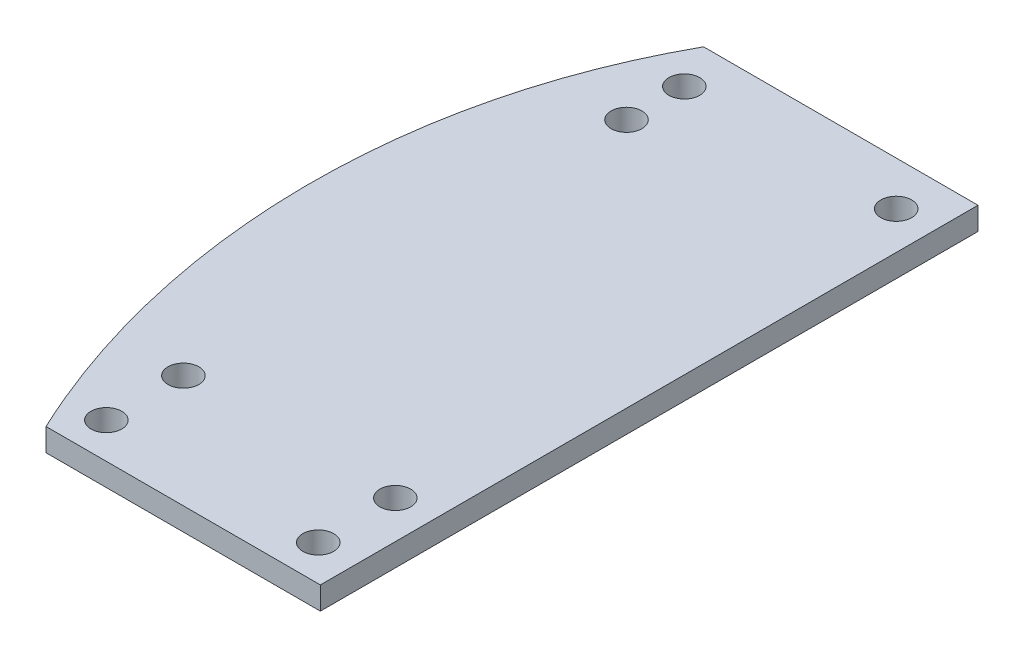
ISO-10303-21;
HEADER;
FILE_DESCRIPTION(('STEP AP214'),'2;1');
FILE_NAME('part.step','',(''),(''),'','','');
FILE_SCHEMA(('AUTOMOTIVE_DESIGN { 1 0 10303 214 1 1 1 1 }'));
ENDSEC;
DATA;
#1=APPLICATION_CONTEXT('core data for automotive mechanical design processes');
#2=APPLICATION_PROTOCOL_DEFINITION('international standard','automotive_design',2000,#1);
#3=PRODUCT_CONTEXT('',#1,'mechanical');
#4=PRODUCT('Part','Part','',(#3));
#5=PRODUCT_RELATED_PRODUCT_CATEGORY('part','',(#4));
#6=PRODUCT_DEFINITION_FORMATION('','',#4);
#7=PRODUCT_DEFINITION_CONTEXT('part definition',#1,'design');
#8=PRODUCT_DEFINITION('design','',#6,#7);
#9=PRODUCT_DEFINITION_SHAPE('','',#8);
#10=(LENGTH_UNIT() NAMED_UNIT(*) SI_UNIT(.MILLI.,.METRE.));
#11=(NAMED_UNIT(*) PLANE_ANGLE_UNIT() SI_UNIT($,.RADIAN.));
#12=(NAMED_UNIT(*) SI_UNIT($,.STERADIAN.) SOLID_ANGLE_UNIT());
#13=UNCERTAINTY_MEASURE_WITH_UNIT(LENGTH_MEASURE(1.E-05),#10,'distance_accuracy_value','');
#14=(GEOMETRIC_REPRESENTATION_CONTEXT(3) GLOBAL_UNCERTAINTY_ASSIGNED_CONTEXT((#13)) GLOBAL_UNIT_ASSIGNED_CONTEXT((#10,
#11,#12)) REPRESENTATION_CONTEXT('',''));
#15=CARTESIAN_POINT('',(0.,0.,0.));
#16=DIRECTION('',(0.,0.,1.));
#17=DIRECTION('',(1.,0.,0.));
#18=AXIS2_PLACEMENT_3D('',#15,#16,#17);
#19=CARTESIAN_POINT('',(20.3965825261335,-1.3622,86.1274069272128));
#20=DIRECTION('',(0.,0.,1.));
#21=DIRECTION('',(1.,0.,0.));
#22=AXIS2_PLACEMENT_3D('',#19,#20,#21);
#23=PLANE('',#22);
#24=DIRECTION('',(0.,1.,0.));
#25=VECTOR('',#24,1.);
#26=CARTESIAN_POINT('',(20.3965825261335,-1.3622,86.1274069272128));
#27=LINE('',#26,#25);
#28=CARTESIAN_POINT('',(20.3965825261335,-1.3622,86.1274069272128));
#29=VERTEX_POINT('',#28);
#30=CARTESIAN_POINT('',(20.3965825261335,1.,86.1274069272128));
#31=VERTEX_POINT('',#30);
#32=EDGE_CURVE('E35',#29,#31,#27,.T.);
#33=ORIENTED_EDGE('',*,*,#32,.T.);
#34=DIRECTION('',(1.,0.,0.));
#35=VECTOR('',#34,1.);
#36=CARTESIAN_POINT('',(20.3965825261335,1.,86.1274069272128));
#37=LINE('',#36,#35);
#38=CARTESIAN_POINT('',(-8.08799373657945,1.,86.1274069272128));
#39=VERTEX_POINT('',#38);
#40=EDGE_CURVE('E72',#39,#31,#37,.T.);
#41=ORIENTED_EDGE('',*,*,#40,.F.);
#42=DIRECTION('',(0.,1.,0.));
#43=VECTOR('',#42,1.);
#44=CARTESIAN_POINT('',(-8.08799373657945,-1.3622,86.1274069272128));
#45=LINE('',#44,#43);
#46=CARTESIAN_POINT('',(-8.08799373657945,-1.3622,86.1274069272128));
#47=VERTEX_POINT('',#46);
#48=EDGE_CURVE('E11',#47,#39,#45,.T.);
#49=ORIENTED_EDGE('',*,*,#48,.F.);
#50=DIRECTION('',(1.,0.,0.));
#51=VECTOR('',#50,1.);
#52=CARTESIAN_POINT('',(20.3965825261335,-1.3622,86.1274069272128));
#53=LINE('',#52,#51);
#54=EDGE_CURVE('E73',#47,#29,#53,.T.);
#55=ORIENTED_EDGE('',*,*,#54,.T.);
#56=EDGE_LOOP('',(#33,#41,#49,#55));
#57=FACE_BOUND('',#56,.T.);
#58=ADVANCED_FACE('F32',(#57),#23,.T.);
#59=CARTESIAN_POINT('',(-8.08799373657945,-1.3622,17.8578544233072));
#60=CARTESIAN_POINT('',(-19.8235237033801,-1.3622,38.9810157448307));
#61=CARTESIAN_POINT('',(-18.0628355171282,-1.3622,64.9856531203526));
#62=CARTESIAN_POINT('',(-8.08799373657945,-1.3622,86.1274069272128));
#63=B_SPLINE_CURVE_WITH_KNOTS('',3,(#59,#60,#61,#62),.UNSPECIFIED.,.F.,.F.,(4,4),(0.,1.),.UNSPECIFIED.);
#64=DIRECTION('',(0.,1.,0.));
#65=VECTOR('',#64,1.);
#66=SURFACE_OF_LINEAR_EXTRUSION('',#63,#65);
#67=ORIENTED_EDGE('',*,*,#48,.T.);
#68=CARTESIAN_POINT('',(-8.08799373657945,1.,17.8578544233072));
#69=CARTESIAN_POINT('',(-19.8235237033801,1.,38.9810157448307));
#70=CARTESIAN_POINT('',(-18.0628355171282,1.,64.9856531203526));
#71=CARTESIAN_POINT('',(-8.08799373657945,1.,86.1274069272128));
#72=B_SPLINE_CURVE_WITH_KNOTS('',3,(#68,#69,#70,#71),.UNSPECIFIED.,.F.,.F.,(4,4),(0.,1.),.UNSPECIFIED.);
#73=CARTESIAN_POINT('',(-8.08799373657945,1.,17.8578544233072));
#74=VERTEX_POINT('',#73);
#75=EDGE_CURVE('E89',#74,#39,#72,.T.);
#76=ORIENTED_EDGE('',*,*,#75,.F.);
#77=DIRECTION('',(0.,1.,0.));
#78=VECTOR('',#77,1.);
#79=CARTESIAN_POINT('',(-8.08799373657945,-1.3622,17.8578544233072));
#80=LINE('',#79,#78);
#81=CARTESIAN_POINT('',(-8.08799373657945,-1.3622,17.8578544233072));
#82=VERTEX_POINT('',#81);
#83=EDGE_CURVE('E40',#82,#74,#80,.T.);
#84=ORIENTED_EDGE('',*,*,#83,.F.);
#85=EDGE_CURVE('E78',#82,#47,#63,.T.);
#86=ORIENTED_EDGE('',*,*,#85,.T.);
#87=EDGE_LOOP('',(#67,#76,#84,#86));
#88=FACE_BOUND('',#87,.T.);
#89=ADVANCED_FACE('F117',(#88),#66,.T.);
#90=CARTESIAN_POINT('',(-8.08799373657945,-1.3622,17.8578544233072));
#91=DIRECTION('',(0.,0.,-1.));
#92=DIRECTION('',(-1.,0.,0.));
#93=AXIS2_PLACEMENT_3D('',#90,#91,#92);
#94=PLANE('',#93);
#95=ORIENTED_EDGE('',*,*,#83,.T.);
#96=DIRECTION('',(-1.,0.,0.));
#97=VECTOR('',#96,1.);
#98=CARTESIAN_POINT('',(-8.08799373657945,1.,17.8578544233072));
#99=LINE('',#98,#97);
#100=CARTESIAN_POINT('',(20.3965825261335,1.,17.8578544233072));
#101=VERTEX_POINT('',#100);
#102=EDGE_CURVE('E85',#101,#74,#99,.T.);
#103=ORIENTED_EDGE('',*,*,#102,.F.);
#104=DIRECTION('',(0.,1.,0.));
#105=VECTOR('',#104,1.);
#106=CARTESIAN_POINT('',(20.3965825261335,-1.3622,17.8578544233072));
#107=LINE('',#106,#105);
#108=CARTESIAN_POINT('',(20.3965825261335,-1.3622,17.8578544233072));
#109=VERTEX_POINT('',#108);
#110=EDGE_CURVE('E77',#109,#101,#107,.T.);
#111=ORIENTED_EDGE('',*,*,#110,.F.);
#112=DIRECTION('',(-1.,0.,0.));
#113=VECTOR('',#112,1.);
#114=CARTESIAN_POINT('',(-8.08799373657945,-1.3622,17.8578544233072));
#115=LINE('',#114,#113);
#116=EDGE_CURVE('E107',#109,#82,#115,.T.);
#117=ORIENTED_EDGE('',*,*,#116,.T.);
#118=EDGE_LOOP('',(#95,#103,#111,#117));
#119=FACE_BOUND('',#118,.T.);
#120=ADVANCED_FACE('F121',(#119),#94,.T.);
#121=CARTESIAN_POINT('',(20.3965825261335,-1.3622,86.1274069272128));
#122=DIRECTION('',(1.,0.,0.));
#123=DIRECTION('',(0.,0.,-1.));
#124=AXIS2_PLACEMENT_3D('',#121,#122,#123);
#125=PLANE('',#124);
#126=ORIENTED_EDGE('',*,*,#110,.T.);
#127=DIRECTION('',(0.,0.,-1.));
#128=VECTOR('',#127,1.);
#129=CARTESIAN_POINT('',(20.3965825261335,1.,86.1274069272128));
#130=LINE('',#129,#128);
#131=EDGE_CURVE('E80',#31,#101,#130,.T.);
#132=ORIENTED_EDGE('',*,*,#131,.F.);
#133=ORIENTED_EDGE('',*,*,#32,.F.);
#134=DIRECTION('',(0.,0.,-1.));
#135=VECTOR('',#134,1.);
#136=CARTESIAN_POINT('',(20.3965825261335,-1.3622,86.1274069272128));
#137=LINE('',#136,#135);
#138=EDGE_CURVE('E105',#29,#109,#137,.T.);
#139=ORIENTED_EDGE('',*,*,#138,.T.);
#140=EDGE_LOOP('',(#126,#132,#133,#139));
#141=FACE_BOUND('',#140,.T.);
#142=ADVANCED_FACE('F81',(#141),#125,.T.);
#143=CARTESIAN_POINT('',(-16.2293831418355,-1.3622,51.9856584932587));
#144=DIRECTION('',(0.,-1.,0.));
#145=DIRECTION('',(0.,0.,-1.));
#146=AXIS2_PLACEMENT_3D('',#143,#144,#145);
#147=PLANE('',#146);
#148=CARTESIAN_POINT('',(-5.52763276646201,-1.3622,28.4235055353303));
#149=DIRECTION('',(0.,-1.,0.));
#150=DIRECTION('',(0.,0.,-1.));
#151=AXIS2_PLACEMENT_3D('',#148,#149,#150);
#152=CIRCLE('',#151,1.6);
#153=CARTESIAN_POINT('',(-5.52763276646201,-1.3622,26.8235055353304));
#154=VERTEX_POINT('',#153);
#155=EDGE_CURVE('E237',#154,#154,#152,.T.);
#156=ORIENTED_EDGE('',*,*,#155,.F.);
#157=EDGE_LOOP('',(#156));
#158=FACE_BOUND('',#157,.T.);
#159=CARTESIAN_POINT('',(16.472367233538,-1.3622,74.4235055353303));
#160=DIRECTION('',(0.,-1.,0.));
#161=DIRECTION('',(0.,0.,-1.));
#162=AXIS2_PLACEMENT_3D('',#159,#160,#161);
#163=CIRCLE('',#162,1.6);
#164=CARTESIAN_POINT('',(16.472367233538,-1.3622,72.8235055353303));
#165=VERTEX_POINT('',#164);
#166=EDGE_CURVE('E247',#165,#165,#163,.T.);
#167=ORIENTED_EDGE('',*,*,#166,.F.);
#168=EDGE_LOOP('',(#167));
#169=FACE_BOUND('',#168,.T.);
#170=CARTESIAN_POINT('',(-5.527632766462,-1.3622,74.4235055353303));
#171=DIRECTION('',(0.,-1.,0.));
#172=DIRECTION('',(0.,0.,-1.));
#173=AXIS2_PLACEMENT_3D('',#170,#171,#172);
#174=CIRCLE('',#173,1.6);
#175=CARTESIAN_POINT('',(-5.527632766462,-1.3622,72.8235055353303));
#176=VERTEX_POINT('',#175);
#177=EDGE_CURVE('E253',#176,#176,#174,.T.);
#178=ORIENTED_EDGE('',*,*,#177,.F.);
#179=EDGE_LOOP('',(#178));
#180=FACE_BOUND('',#179,.T.);
#181=CARTESIAN_POINT('',(16.472367233538,-1.3622,82.4235055353303));
#182=DIRECTION('',(0.,-1.,0.));
#183=DIRECTION('',(0.,0.,-1.));
#184=AXIS2_PLACEMENT_3D('',#181,#182,#183);
#185=CIRCLE('',#184,1.60000000000001);
#186=CARTESIAN_POINT('',(16.472367233538,-1.3622,80.8235055353303));
#187=VERTEX_POINT('',#186);
#188=EDGE_CURVE('E259',#187,#187,#185,.T.);
#189=ORIENTED_EDGE('',*,*,#188,.F.);
#190=EDGE_LOOP('',(#189));
#191=FACE_BOUND('',#190,.T.);
#192=CARTESIAN_POINT('',(-5.527632766462,-1.3622,82.4235055353303));
#193=DIRECTION('',(0.,-1.,0.));
#194=DIRECTION('',(0.,0.,-1.));
#195=AXIS2_PLACEMENT_3D('',#192,#193,#194);
#196=CIRCLE('',#195,1.60000000000001);
#197=CARTESIAN_POINT('',(-5.527632766462,-1.3622,80.8235055353303));
#198=VERTEX_POINT('',#197);
#199=EDGE_CURVE('E265',#198,#198,#196,.T.);
#200=ORIENTED_EDGE('',*,*,#199,.F.);
#201=EDGE_LOOP('',(#200));
#202=FACE_BOUND('',#201,.T.);
#203=CARTESIAN_POINT('',(16.472367233538,-1.3622,22.4235055353303));
#204=DIRECTION('',(0.,-1.,0.));
#205=DIRECTION('',(0.,0.,-1.));
#206=AXIS2_PLACEMENT_3D('',#203,#204,#205);
#207=CIRCLE('',#206,1.6);
#208=CARTESIAN_POINT('',(16.472367233538,-1.3622,20.8235055353304));
#209=VERTEX_POINT('',#208);
#210=EDGE_CURVE('E271',#209,#209,#207,.T.);
#211=ORIENTED_EDGE('',*,*,#210,.F.);
#212=EDGE_LOOP('',(#211));
#213=FACE_BOUND('',#212,.T.);
#214=CARTESIAN_POINT('',(-5.52763276646201,-1.3622,22.4235055353304));
#215=DIRECTION('',(0.,-1.,0.));
#216=DIRECTION('',(0.,0.,-1.));
#217=AXIS2_PLACEMENT_3D('',#214,#215,#216);
#218=CIRCLE('',#217,1.59999999999999);
#219=CARTESIAN_POINT('',(-5.52763276646201,-1.3622,20.8235055353304));
#220=VERTEX_POINT('',#219);
#221=EDGE_CURVE('E90',#220,#220,#218,.T.);
#222=ORIENTED_EDGE('',*,*,#221,.F.);
#223=EDGE_LOOP('',(#222));
#224=FACE_BOUND('',#223,.T.);
#225=ORIENTED_EDGE('',*,*,#54,.F.);
#226=ORIENTED_EDGE('',*,*,#85,.F.);
#227=ORIENTED_EDGE('',*,*,#116,.F.);
#228=ORIENTED_EDGE('',*,*,#138,.F.);
#229=EDGE_LOOP('',(#225,#226,#227,#228));
#230=FACE_BOUND('',#229,.T.);
#231=ADVANCED_FACE('F122',(#158,#169,#180,#191,#202,#213,#224,#230),#147,.T.);
#232=CARTESIAN_POINT('',(-16.2293831418355,1.,51.9856584932587));
#233=DIRECTION('',(0.,-1.,0.));
#234=DIRECTION('',(0.,0.,-1.));
#235=AXIS2_PLACEMENT_3D('',#232,#233,#234);
#236=PLANE('',#235);
#237=CARTESIAN_POINT('',(-5.52763276646201,1.,28.4235055353303));
#238=DIRECTION('',(0.,1.,0.));
#239=DIRECTION('',(0.,0.,1.));
#240=AXIS2_PLACEMENT_3D('',#237,#238,#239);
#241=CIRCLE('',#240,1.6);
#242=CARTESIAN_POINT('',(-5.52763276646201,1.,30.0235055353304));
#243=VERTEX_POINT('',#242);
#244=EDGE_CURVE('E240',#243,#243,#241,.T.);
#245=ORIENTED_EDGE('',*,*,#244,.F.);
#246=EDGE_LOOP('',(#245));
#247=FACE_BOUND('',#246,.T.);
#248=CARTESIAN_POINT('',(16.472367233538,1.,74.4235055353303));
#249=DIRECTION('',(0.,1.,0.));
#250=DIRECTION('',(0.,0.,1.));
#251=AXIS2_PLACEMENT_3D('',#248,#249,#250);
#252=CIRCLE('',#251,1.6);
#253=CARTESIAN_POINT('',(16.472367233538,1.,76.0235055353304));
#254=VERTEX_POINT('',#253);
#255=EDGE_CURVE('E242',#254,#254,#252,.T.);
#256=ORIENTED_EDGE('',*,*,#255,.F.);
#257=EDGE_LOOP('',(#256));
#258=FACE_BOUND('',#257,.T.);
#259=CARTESIAN_POINT('',(-5.527632766462,1.,74.4235055353303));
#260=DIRECTION('',(0.,1.,0.));
#261=DIRECTION('',(0.,0.,1.));
#262=AXIS2_PLACEMENT_3D('',#259,#260,#261);
#263=CIRCLE('',#262,1.6);
#264=CARTESIAN_POINT('',(-5.527632766462,1.,76.0235055353304));
#265=VERTEX_POINT('',#264);
#266=EDGE_CURVE('E250',#265,#265,#263,.T.);
#267=ORIENTED_EDGE('',*,*,#266,.F.);
#268=EDGE_LOOP('',(#267));
#269=FACE_BOUND('',#268,.T.);
#270=CARTESIAN_POINT('',(16.472367233538,1.,82.4235055353303));
#271=DIRECTION('',(0.,1.,0.));
#272=DIRECTION('',(0.,0.,1.));
#273=AXIS2_PLACEMENT_3D('',#270,#271,#272);
#274=CIRCLE('',#273,1.60000000000001);
#275=CARTESIAN_POINT('',(16.472367233538,1.,84.0235055353304));
#276=VERTEX_POINT('',#275);
#277=EDGE_CURVE('E256',#276,#276,#274,.T.);
#278=ORIENTED_EDGE('',*,*,#277,.F.);
#279=EDGE_LOOP('',(#278));
#280=FACE_BOUND('',#279,.T.);
#281=CARTESIAN_POINT('',(-5.527632766462,1.,82.4235055353303));
#282=DIRECTION('',(0.,1.,0.));
#283=DIRECTION('',(0.,0.,1.));
#284=AXIS2_PLACEMENT_3D('',#281,#282,#283);
#285=CIRCLE('',#284,1.60000000000001);
#286=CARTESIAN_POINT('',(-5.527632766462,1.,84.0235055353303));
#287=VERTEX_POINT('',#286);
#288=EDGE_CURVE('E262',#287,#287,#285,.T.);
#289=ORIENTED_EDGE('',*,*,#288,.F.);
#290=EDGE_LOOP('',(#289));
#291=FACE_BOUND('',#290,.T.);
#292=CARTESIAN_POINT('',(16.472367233538,1.,22.4235055353303));
#293=DIRECTION('',(0.,1.,0.));
#294=DIRECTION('',(0.,0.,1.));
#295=AXIS2_PLACEMENT_3D('',#292,#293,#294);
#296=CIRCLE('',#295,1.6);
#297=CARTESIAN_POINT('',(16.472367233538,1.,24.0235055353303));
#298=VERTEX_POINT('',#297);
#299=EDGE_CURVE('E268',#298,#298,#296,.T.);
#300=ORIENTED_EDGE('',*,*,#299,.F.);
#301=EDGE_LOOP('',(#300));
#302=FACE_BOUND('',#301,.T.);
#303=CARTESIAN_POINT('',(-5.52763276646201,1.,22.4235055353304));
#304=DIRECTION('',(0.,1.,0.));
#305=DIRECTION('',(0.,0.,1.));
#306=AXIS2_PLACEMENT_3D('',#303,#304,#305);
#307=CIRCLE('',#306,1.59999999999999);
#308=CARTESIAN_POINT('',(-5.52763276646201,1.,24.0235055353303));
#309=VERTEX_POINT('',#308);
#310=EDGE_CURVE('E93',#309,#309,#307,.T.);
#311=ORIENTED_EDGE('',*,*,#310,.F.);
#312=EDGE_LOOP('',(#311));
#313=FACE_BOUND('',#312,.T.);
#314=ORIENTED_EDGE('',*,*,#40,.T.);
#315=ORIENTED_EDGE('',*,*,#131,.T.);
#316=ORIENTED_EDGE('',*,*,#102,.T.);
#317=ORIENTED_EDGE('',*,*,#75,.T.);
#318=EDGE_LOOP('',(#314,#315,#316,#317));
#319=FACE_BOUND('',#318,.T.);
#320=ADVANCED_FACE('F88',(#247,#258,#269,#280,#291,#302,#313,#319),#236,.F.);
#321=CARTESIAN_POINT('',(-5.52763276646201,-9.,22.4235055353304));
#322=DIRECTION('',(0.,1.,0.));
#323=DIRECTION('',(0.,0.,1.));
#324=AXIS2_PLACEMENT_3D('',#321,#322,#323);
#325=CYLINDRICAL_SURFACE('',#324,1.59999999999999);
#326=ORIENTED_EDGE('',*,*,#221,.T.);
#327=EDGE_LOOP('',(#326));
#328=FACE_BOUND('',#327,.T.);
#329=ORIENTED_EDGE('',*,*,#310,.T.);
#330=EDGE_LOOP('',(#329));
#331=FACE_BOUND('',#330,.T.);
#332=ADVANCED_FACE('F161',(#328,#331),#325,.F.);
#333=CARTESIAN_POINT('',(16.472367233538,-9.,22.4235055353303));
#334=DIRECTION('',(0.,1.,0.));
#335=DIRECTION('',(0.,0.,1.));
#336=AXIS2_PLACEMENT_3D('',#333,#334,#335);
#337=CYLINDRICAL_SURFACE('',#336,1.6);
#338=ORIENTED_EDGE('',*,*,#210,.T.);
#339=EDGE_LOOP('',(#338));
#340=FACE_BOUND('',#339,.T.);
#341=ORIENTED_EDGE('',*,*,#299,.T.);
#342=EDGE_LOOP('',(#341));
#343=FACE_BOUND('',#342,.T.);
#344=ADVANCED_FACE('F170',(#340,#343),#337,.F.);
#345=CARTESIAN_POINT('',(-5.527632766462,-9.,82.4235055353303));
#346=DIRECTION('',(0.,1.,0.));
#347=DIRECTION('',(0.,0.,1.));
#348=AXIS2_PLACEMENT_3D('',#345,#346,#347);
#349=CYLINDRICAL_SURFACE('',#348,1.60000000000001);
#350=ORIENTED_EDGE('',*,*,#199,.T.);
#351=EDGE_LOOP('',(#350));
#352=FACE_BOUND('',#351,.T.);
#353=ORIENTED_EDGE('',*,*,#288,.T.);
#354=EDGE_LOOP('',(#353));
#355=FACE_BOUND('',#354,.T.);
#356=ADVANCED_FACE('F180',(#352,#355),#349,.F.);
#357=CARTESIAN_POINT('',(16.472367233538,-9.,82.4235055353303));
#358=DIRECTION('',(0.,1.,0.));
#359=DIRECTION('',(0.,0.,1.));
#360=AXIS2_PLACEMENT_3D('',#357,#358,#359);
#361=CYLINDRICAL_SURFACE('',#360,1.60000000000001);
#362=ORIENTED_EDGE('',*,*,#188,.T.);
#363=EDGE_LOOP('',(#362));
#364=FACE_BOUND('',#363,.T.);
#365=ORIENTED_EDGE('',*,*,#277,.T.);
#366=EDGE_LOOP('',(#365));
#367=FACE_BOUND('',#366,.T.);
#368=ADVANCED_FACE('F190',(#364,#367),#361,.F.);
#369=CARTESIAN_POINT('',(-5.527632766462,-9.,74.4235055353303));
#370=DIRECTION('',(0.,1.,0.));
#371=DIRECTION('',(0.,0.,1.));
#372=AXIS2_PLACEMENT_3D('',#369,#370,#371);
#373=CYLINDRICAL_SURFACE('',#372,1.6);
#374=ORIENTED_EDGE('',*,*,#177,.T.);
#375=EDGE_LOOP('',(#374));
#376=FACE_BOUND('',#375,.T.);
#377=ORIENTED_EDGE('',*,*,#266,.T.);
#378=EDGE_LOOP('',(#377));
#379=FACE_BOUND('',#378,.T.);
#380=ADVANCED_FACE('F200',(#376,#379),#373,.F.);
#381=CARTESIAN_POINT('',(16.472367233538,-9.,74.4235055353303));
#382=DIRECTION('',(0.,1.,0.));
#383=DIRECTION('',(0.,0.,1.));
#384=AXIS2_PLACEMENT_3D('',#381,#382,#383);
#385=CYLINDRICAL_SURFACE('',#384,1.6);
#386=ORIENTED_EDGE('',*,*,#166,.T.);
#387=EDGE_LOOP('',(#386));
#388=FACE_BOUND('',#387,.T.);
#389=ORIENTED_EDGE('',*,*,#255,.T.);
#390=EDGE_LOOP('',(#389));
#391=FACE_BOUND('',#390,.T.);
#392=ADVANCED_FACE('F210',(#388,#391),#385,.F.);
#393=CARTESIAN_POINT('',(-5.52763276646201,-9.,28.4235055353303));
#394=DIRECTION('',(0.,1.,0.));
#395=DIRECTION('',(0.,0.,1.));
#396=AXIS2_PLACEMENT_3D('',#393,#394,#395);
#397=CYLINDRICAL_SURFACE('',#396,1.6);
#398=ORIENTED_EDGE('',*,*,#155,.T.);
#399=EDGE_LOOP('',(#398));
#400=FACE_BOUND('',#399,.T.);
#401=ORIENTED_EDGE('',*,*,#244,.T.);
#402=EDGE_LOOP('',(#401));
#403=FACE_BOUND('',#402,.T.);
#404=ADVANCED_FACE('F220',(#400,#403),#397,.F.);
#405=CLOSED_SHELL('',(#58,#89,#120,#142,#231,#320,#332,#344,#356,#368,#380,#392,#404));
#406=MANIFOLD_SOLID_BREP('B2',#405);
#407=ADVANCED_BREP_SHAPE_REPRESENTATION('',(#18,#406),#14);
#408=SHAPE_DEFINITION_REPRESENTATION(#9,#407);
ENDSEC;
END-ISO-10303-21;
